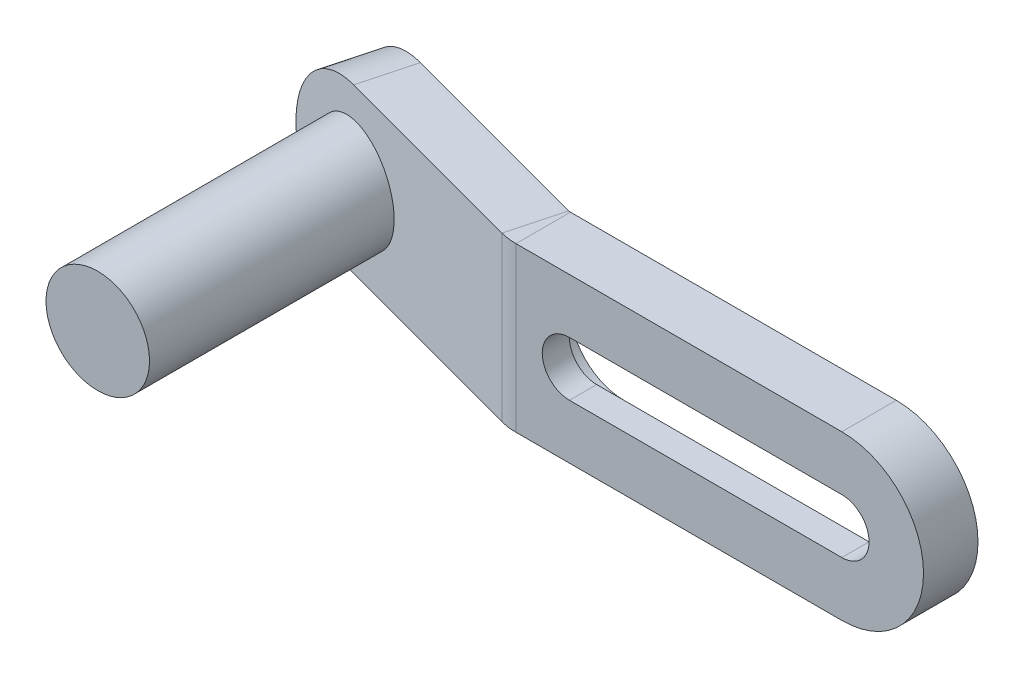
ISO-10303-21;
HEADER;
FILE_DESCRIPTION(('STEP AP214'),'2;1');
FILE_NAME('part.step','',(''),(''),'','','');
FILE_SCHEMA(('AUTOMOTIVE_DESIGN { 1 0 10303 214 1 1 1 1 }'));
ENDSEC;
DATA;
#1=APPLICATION_CONTEXT('core data for automotive mechanical design processes');
#2=APPLICATION_PROTOCOL_DEFINITION('international standard','automotive_design',2000,#1);
#3=PRODUCT_CONTEXT('',#1,'mechanical');
#4=PRODUCT('Part','Part','',(#3));
#5=PRODUCT_RELATED_PRODUCT_CATEGORY('part','',(#4));
#6=PRODUCT_DEFINITION_FORMATION('','',#4);
#7=PRODUCT_DEFINITION_CONTEXT('part definition',#1,'design');
#8=PRODUCT_DEFINITION('design','',#6,#7);
#9=PRODUCT_DEFINITION_SHAPE('','',#8);
#10=(LENGTH_UNIT() NAMED_UNIT(*) SI_UNIT(.MILLI.,.METRE.));
#11=(NAMED_UNIT(*) PLANE_ANGLE_UNIT() SI_UNIT($,.RADIAN.));
#12=(NAMED_UNIT(*) SI_UNIT($,.STERADIAN.) SOLID_ANGLE_UNIT());
#13=UNCERTAINTY_MEASURE_WITH_UNIT(LENGTH_MEASURE(1.E-05),#10,'distance_accuracy_value','');
#14=(GEOMETRIC_REPRESENTATION_CONTEXT(3) GLOBAL_UNCERTAINTY_ASSIGNED_CONTEXT((#13)) GLOBAL_UNIT_ASSIGNED_CONTEXT((#10,
#11,#12)) REPRESENTATION_CONTEXT('',''));
#15=CARTESIAN_POINT('',(0.,0.,0.));
#16=DIRECTION('',(0.,0.,1.));
#17=DIRECTION('',(1.,0.,0.));
#18=AXIS2_PLACEMENT_3D('',#15,#16,#17);
#19=CARTESIAN_POINT('',(0.,-2.49999999999999,11.3638809020505));
#20=DIRECTION('',(0.,-1.,0.));
#21=DIRECTION('',(0.,0.,-1.));
#22=AXIS2_PLACEMENT_3D('',#19,#20,#21);
#23=PLANE('',#22);
#24=DIRECTION('',(1.,0.,0.));
#25=VECTOR('',#24,1.);
#26=CARTESIAN_POINT('',(0.,-2.49999999999999,3.86388090205045));
#27=LINE('',#26,#25);
#28=CARTESIAN_POINT('',(24.6634623965384,-2.49999999999999,3.86388090205054));
#29=VERTEX_POINT('',#28);
#30=CARTESIAN_POINT('',(49.6634623965384,-2.50000000000001,3.86388090205062));
#31=VERTEX_POINT('',#30);
#32=EDGE_CURVE('E211',#29,#31,#27,.T.);
#33=ORIENTED_EDGE('',*,*,#32,.F.);
#34=DIRECTION('',(0.,0.,-1.));
#35=VECTOR('',#34,1.);
#36=CARTESIAN_POINT('',(24.6634623965383,-2.49999999999999,11.3638809020505));
#37=LINE('',#36,#35);
#38=CARTESIAN_POINT('',(24.6634623965384,-2.49999999999999,6.36388090205053));
#39=VERTEX_POINT('',#38);
#40=EDGE_CURVE('E226',#39,#29,#37,.T.);
#41=ORIENTED_EDGE('',*,*,#40,.F.);
#42=DIRECTION('',(-1.,0.,0.));
#43=VECTOR('',#42,1.);
#44=CARTESIAN_POINT('',(49.6634623965384,-2.49999999999999,6.36388090205062));
#45=LINE('',#44,#43);
#46=CARTESIAN_POINT('',(49.6634623965384,-2.5,6.36388090205061));
#47=VERTEX_POINT('',#46);
#48=EDGE_CURVE('E13',#47,#39,#45,.T.);
#49=ORIENTED_EDGE('',*,*,#48,.F.);
#50=DIRECTION('',(0.,0.,-1.));
#51=VECTOR('',#50,1.);
#52=CARTESIAN_POINT('',(49.6634623965383,-2.5,11.3638809020506));
#53=LINE('',#52,#51);
#54=EDGE_CURVE('E234',#47,#31,#53,.T.);
#55=ORIENTED_EDGE('',*,*,#54,.T.);
#56=EDGE_LOOP('',(#33,#41,#49,#55));
#57=FACE_BOUND('',#56,.T.);
#58=ADVANCED_FACE('F48',(#57),#23,.F.);
#59=CARTESIAN_POINT('',(49.6634623965383,0.,11.3638809020506));
#60=DIRECTION('',(0.,0.,-1.));
#61=DIRECTION('',(-1.,0.,0.));
#62=AXIS2_PLACEMENT_3D('',#59,#60,#61);
#63=CYLINDRICAL_SURFACE('',#62,2.5);
#64=CARTESIAN_POINT('',(49.6634623965384,0.,3.86388090205062));
#65=DIRECTION('',(0.,0.,-1.));
#66=DIRECTION('',(-1.,0.,0.));
#67=AXIS2_PLACEMENT_3D('',#64,#65,#66);
#68=CIRCLE('',#67,2.5);
#69=CARTESIAN_POINT('',(49.6634623965384,2.49999999999999,3.86388090205062));
#70=VERTEX_POINT('',#69);
#71=EDGE_CURVE('E184',#31,#70,#68,.F.);
#72=ORIENTED_EDGE('',*,*,#71,.F.);
#73=ORIENTED_EDGE('',*,*,#54,.F.);
#74=CARTESIAN_POINT('',(49.6634623965384,0.,6.36388090205062));
#75=DIRECTION('',(0.,0.,-1.));
#76=DIRECTION('',(-1.,0.,0.));
#77=AXIS2_PLACEMENT_3D('',#74,#75,#76);
#78=CIRCLE('',#77,2.5);
#79=CARTESIAN_POINT('',(49.6634623965384,2.49999999999999,6.36388090205058));
#80=VERTEX_POINT('',#79);
#81=EDGE_CURVE('E56',#80,#47,#78,.T.);
#82=ORIENTED_EDGE('',*,*,#81,.F.);
#83=DIRECTION('',(0.,0.,-1.));
#84=VECTOR('',#83,1.);
#85=CARTESIAN_POINT('',(49.6634623965383,2.49999999999999,11.3638809020506));
#86=LINE('',#85,#84);
#87=EDGE_CURVE('E238',#80,#70,#86,.T.);
#88=ORIENTED_EDGE('',*,*,#87,.T.);
#89=EDGE_LOOP('',(#72,#73,#82,#88));
#90=FACE_BOUND('',#89,.T.);
#91=ADVANCED_FACE('F334',(#90),#63,.F.);
#92=CARTESIAN_POINT('',(0.,2.49999999999999,11.3638809020505));
#93=DIRECTION('',(0.,-1.,0.));
#94=DIRECTION('',(0.,0.,-1.));
#95=AXIS2_PLACEMENT_3D('',#92,#93,#94);
#96=PLANE('',#95);
#97=DIRECTION('',(0.,0.,-1.));
#98=VECTOR('',#97,1.);
#99=CARTESIAN_POINT('',(24.6634623965383,2.49999999999999,11.3638809020505));
#100=LINE('',#99,#98);
#101=CARTESIAN_POINT('',(24.6634623965384,2.49999999999999,6.36388090205054));
#102=VERTEX_POINT('',#101);
#103=CARTESIAN_POINT('',(24.6634623965384,2.49999999999999,3.86388090205053));
#104=VERTEX_POINT('',#103);
#105=EDGE_CURVE('E241',#102,#104,#100,.T.);
#106=ORIENTED_EDGE('',*,*,#105,.T.);
#107=DIRECTION('',(-1.,0.,0.));
#108=VECTOR('',#107,1.);
#109=CARTESIAN_POINT('',(0.,2.49999999999999,3.86388090205045));
#110=LINE('',#109,#108);
#111=EDGE_CURVE('E71',#70,#104,#110,.T.);
#112=ORIENTED_EDGE('',*,*,#111,.F.);
#113=ORIENTED_EDGE('',*,*,#87,.F.);
#114=DIRECTION('',(-1.,0.,0.));
#115=VECTOR('',#114,1.);
#116=CARTESIAN_POINT('',(49.6634623965384,2.49999999999999,6.36388090205062));
#117=LINE('',#116,#115);
#118=EDGE_CURVE('E323',#80,#102,#117,.T.);
#119=ORIENTED_EDGE('',*,*,#118,.T.);
#120=EDGE_LOOP('',(#106,#112,#113,#119));
#121=FACE_BOUND('',#120,.T.);
#122=ADVANCED_FACE('F336',(#121),#96,.T.);
#123=CARTESIAN_POINT('',(24.6634623965383,0.,11.3638809020505));
#124=DIRECTION('',(0.,0.,-1.));
#125=DIRECTION('',(-1.,0.,0.));
#126=AXIS2_PLACEMENT_3D('',#123,#124,#125);
#127=CYLINDRICAL_SURFACE('',#126,2.49999999999999);
#128=CARTESIAN_POINT('',(24.6634623965384,0.,3.86388090205054));
#129=DIRECTION('',(0.,0.,-1.));
#130=DIRECTION('',(-1.,0.,0.));
#131=AXIS2_PLACEMENT_3D('',#128,#129,#130);
#132=CIRCLE('',#131,2.49999999999999);
#133=EDGE_CURVE('E209',#104,#29,#132,.F.);
#134=ORIENTED_EDGE('',*,*,#133,.F.);
#135=ORIENTED_EDGE('',*,*,#105,.F.);
#136=CARTESIAN_POINT('',(24.6634623965384,0.,6.36388090205054));
#137=DIRECTION('',(0.,0.,-1.));
#138=DIRECTION('',(-1.,0.,0.));
#139=AXIS2_PLACEMENT_3D('',#136,#137,#138);
#140=CIRCLE('',#139,2.49999999999999);
#141=EDGE_CURVE('E314',#39,#102,#140,.T.);
#142=ORIENTED_EDGE('',*,*,#141,.F.);
#143=ORIENTED_EDGE('',*,*,#40,.T.);
#144=EDGE_LOOP('',(#134,#135,#142,#143));
#145=FACE_BOUND('',#144,.T.);
#146=ADVANCED_FACE('F338',(#145),#127,.F.);
#147=CARTESIAN_POINT('',(49.6634623965384,0.,1.36388090205062));
#148=DIRECTION('',(0.,0.,-1.));
#149=DIRECTION('',(-1.,0.,0.));
#150=AXIS2_PLACEMENT_3D('',#147,#148,#149);
#151=PLANE('',#150);
#152=CARTESIAN_POINT('',(24.6634623965384,0.,1.36388090205054));
#153=DIRECTION('',(0.,0.,-1.));
#154=DIRECTION('',(-1.,0.,0.));
#155=AXIS2_PLACEMENT_3D('',#152,#153,#154);
#156=CIRCLE('',#155,4.99999999999999);
#157=CARTESIAN_POINT('',(19.7555645774293,0.955269070568109,1.36388090205052));
#158=VERTEX_POINT('',#157);
#159=CARTESIAN_POINT('',(24.6634623965384,4.99999999999999,1.36388090205054));
#160=VERTEX_POINT('',#159);
#161=EDGE_CURVE('E195',#158,#160,#156,.T.);
#162=ORIENTED_EDGE('',*,*,#161,.F.);
#163=DIRECTION('',(0.,1.,0.));
#164=VECTOR('',#163,1.);
#165=CARTESIAN_POINT('',(19.7555645774293,0.,1.36388090205052));
#166=LINE('',#165,#164);
#167=CARTESIAN_POINT('',(19.7555645774293,7.5,1.36388090205052));
#168=VERTEX_POINT('',#167);
#169=EDGE_CURVE('E303',#158,#168,#166,.T.);
#170=ORIENTED_EDGE('',*,*,#169,.T.);
#171=DIRECTION('',(1.,0.,0.));
#172=VECTOR('',#171,1.);
#173=CARTESIAN_POINT('',(49.6634623965384,7.49999999999999,1.36388090205062));
#174=LINE('',#173,#172);
#175=CARTESIAN_POINT('',(49.6634623965384,7.49999999999999,1.36388090205062));
#176=VERTEX_POINT('',#175);
#177=EDGE_CURVE('E300',#168,#176,#174,.T.);
#178=ORIENTED_EDGE('',*,*,#177,.T.);
#179=CARTESIAN_POINT('',(49.6634623965384,0.,1.36388090205062));
#180=DIRECTION('',(0.,0.,-1.));
#181=DIRECTION('',(-1.,0.,0.));
#182=AXIS2_PLACEMENT_3D('',#179,#180,#181);
#183=CIRCLE('',#182,7.5);
#184=CARTESIAN_POINT('',(49.6634623965384,-7.50000000000001,1.36388090205062));
#185=VERTEX_POINT('',#184);
#186=EDGE_CURVE('E288',#176,#185,#183,.T.);
#187=ORIENTED_EDGE('',*,*,#186,.T.);
#188=DIRECTION('',(-1.,0.,0.));
#189=VECTOR('',#188,1.);
#190=CARTESIAN_POINT('',(49.6634623965384,-7.50000000000001,1.36388090205062));
#191=LINE('',#190,#189);
#192=CARTESIAN_POINT('',(19.7555645774293,-7.5,1.36388090205052));
#193=VERTEX_POINT('',#192);
#194=EDGE_CURVE('E291',#185,#193,#191,.T.);
#195=ORIENTED_EDGE('',*,*,#194,.T.);
#196=CARTESIAN_POINT('',(19.7555645774293,-0.955269070568108,1.36388090205052));
#197=VERTEX_POINT('',#196);
#198=EDGE_CURVE('E304',#193,#197,#166,.T.);
#199=ORIENTED_EDGE('',*,*,#198,.T.);
#200=CARTESIAN_POINT('',(24.6634623965384,-4.99999999999999,1.36388090205054));
#201=VERTEX_POINT('',#200);
#202=EDGE_CURVE('E63',#201,#197,#156,.T.);
#203=ORIENTED_EDGE('',*,*,#202,.F.);
#204=DIRECTION('',(-1.,0.,0.));
#205=VECTOR('',#204,1.);
#206=CARTESIAN_POINT('',(0.,-4.99999999999999,1.36388090205045));
#207=LINE('',#206,#205);
#208=CARTESIAN_POINT('',(49.6634623965384,-5.,1.36388090205062));
#209=VERTEX_POINT('',#208);
#210=EDGE_CURVE('E217',#209,#201,#207,.T.);
#211=ORIENTED_EDGE('',*,*,#210,.F.);
#212=CARTESIAN_POINT('',(49.6634623965384,0.,1.36388090205062));
#213=DIRECTION('',(0.,0.,-1.));
#214=DIRECTION('',(-1.,0.,0.));
#215=AXIS2_PLACEMENT_3D('',#212,#213,#214);
#216=CIRCLE('',#215,5.);
#217=CARTESIAN_POINT('',(49.6634623965384,4.99999999999999,1.36388090205062));
#218=VERTEX_POINT('',#217);
#219=EDGE_CURVE('E215',#218,#209,#216,.T.);
#220=ORIENTED_EDGE('',*,*,#219,.F.);
#221=DIRECTION('',(-1.,0.,0.));
#222=VECTOR('',#221,1.);
#223=CARTESIAN_POINT('',(0.,4.99999999999999,1.36388090205045));
#224=LINE('',#223,#222);
#225=EDGE_CURVE('E178',#218,#160,#224,.T.);
#226=ORIENTED_EDGE('',*,*,#225,.T.);
#227=EDGE_LOOP('',(#162,#170,#178,#187,#195,#199,#203,#211,#220,#226));
#228=FACE_BOUND('',#227,.T.);
#229=ADVANCED_FACE('F391',(#228),#151,.T.);
#230=CARTESIAN_POINT('',(49.6634623965384,0.,1.36388090205062));
#231=DIRECTION('',(0.,0.,1.));
#232=DIRECTION('',(1.,0.,0.));
#233=AXIS2_PLACEMENT_3D('',#230,#231,#232);
#234=CYLINDRICAL_SURFACE('',#233,7.5);
#235=CARTESIAN_POINT('',(49.6634623965384,0.,6.36388090205062));
#236=DIRECTION('',(0.,0.,-1.));
#237=DIRECTION('',(-1.,0.,0.));
#238=AXIS2_PLACEMENT_3D('',#235,#236,#237);
#239=CIRCLE('',#238,7.5);
#240=CARTESIAN_POINT('',(49.6634623965384,7.49999999999999,6.36388090205062));
#241=VERTEX_POINT('',#240);
#242=CARTESIAN_POINT('',(49.6634623965384,-7.50000000000001,6.36388090205062));
#243=VERTEX_POINT('',#242);
#244=EDGE_CURVE('E260',#241,#243,#239,.T.);
#245=ORIENTED_EDGE('',*,*,#244,.T.);
#246=DIRECTION('',(0.,0.,1.));
#247=VECTOR('',#246,1.);
#248=CARTESIAN_POINT('',(49.6634623965384,-7.50000000000001,1.36388090205062));
#249=LINE('',#248,#247);
#250=EDGE_CURVE('E299',#185,#243,#249,.T.);
#251=ORIENTED_EDGE('',*,*,#250,.F.);
#252=ORIENTED_EDGE('',*,*,#186,.F.);
#253=DIRECTION('',(0.,0.,1.));
#254=VECTOR('',#253,1.);
#255=CARTESIAN_POINT('',(49.6634623965384,7.49999999999999,1.36388090205062));
#256=LINE('',#255,#254);
#257=EDGE_CURVE('E296',#176,#241,#256,.T.);
#258=ORIENTED_EDGE('',*,*,#257,.T.);
#259=EDGE_LOOP('',(#245,#251,#252,#258));
#260=FACE_BOUND('',#259,.T.);
#261=ADVANCED_FACE('F387',(#260),#234,.T.);
#262=CARTESIAN_POINT('',(49.6634623965384,-7.50000000000001,1.36388090205062));
#263=DIRECTION('',(0.,1.,0.));
#264=DIRECTION('',(-0.965925826289068,0.,0.258819045102521));
#265=AXIS2_PLACEMENT_3D('',#262,#263,#264);
#266=PLANE('',#265);
#267=DIRECTION('',(0.,0.,1.));
#268=VECTOR('',#267,1.);
#269=CARTESIAN_POINT('',(19.7555645774293,-7.5,1.36388090205052));
#270=LINE('',#269,#268);
#271=CARTESIAN_POINT('',(19.7555645774292,-7.5,6.36388090205052));
#272=VERTEX_POINT('',#271);
#273=EDGE_CURVE('E307',#193,#272,#270,.T.);
#274=ORIENTED_EDGE('',*,*,#273,.F.);
#275=ORIENTED_EDGE('',*,*,#194,.F.);
#276=ORIENTED_EDGE('',*,*,#250,.T.);
#277=DIRECTION('',(-1.,0.,0.));
#278=VECTOR('',#277,1.);
#279=CARTESIAN_POINT('',(49.6634623965384,-7.50000000000001,6.36388090205062));
#280=LINE('',#279,#278);
#281=EDGE_CURVE('E295',#243,#272,#280,.T.);
#282=ORIENTED_EDGE('',*,*,#281,.T.);
#283=EDGE_LOOP('',(#274,#275,#276,#282));
#284=FACE_BOUND('',#283,.T.);
#285=ADVANCED_FACE('F390',(#284),#266,.F.);
#286=CARTESIAN_POINT('',(49.6634623965384,7.49999999999999,1.36388090205062));
#287=DIRECTION('',(0.,-1.,0.));
#288=DIRECTION('',(0.965925826289068,0.,-0.258819045102521));
#289=AXIS2_PLACEMENT_3D('',#286,#287,#288);
#290=PLANE('',#289);
#291=DIRECTION('',(0.,0.,-1.));
#292=VECTOR('',#291,1.);
#293=CARTESIAN_POINT('',(19.7555645774293,7.5,1.36388090205052));
#294=LINE('',#293,#292);
#295=CARTESIAN_POINT('',(19.7555645774292,7.5,6.36388090205052));
#296=VERTEX_POINT('',#295);
#297=EDGE_CURVE('E311',#296,#168,#294,.T.);
#298=ORIENTED_EDGE('',*,*,#297,.F.);
#299=DIRECTION('',(1.,0.,0.));
#300=VECTOR('',#299,1.);
#301=CARTESIAN_POINT('',(49.6634623965384,7.49999999999999,6.36388090205062));
#302=LINE('',#301,#300);
#303=EDGE_CURVE('E292',#296,#241,#302,.T.);
#304=ORIENTED_EDGE('',*,*,#303,.T.);
#305=ORIENTED_EDGE('',*,*,#257,.F.);
#306=ORIENTED_EDGE('',*,*,#177,.F.);
#307=EDGE_LOOP('',(#298,#304,#305,#306));
#308=FACE_BOUND('',#307,.T.);
#309=ADVANCED_FACE('F50',(#308),#290,.F.);
#310=CARTESIAN_POINT('',(49.6634623965384,0.,6.36388090205062));
#311=DIRECTION('',(0.,0.,-1.));
#312=DIRECTION('',(-1.,0.,0.));
#313=AXIS2_PLACEMENT_3D('',#310,#311,#312);
#314=PLANE('',#313);
#315=ORIENTED_EDGE('',*,*,#81,.T.);
#316=ORIENTED_EDGE('',*,*,#48,.T.);
#317=ORIENTED_EDGE('',*,*,#141,.T.);
#318=ORIENTED_EDGE('',*,*,#118,.F.);
#319=EDGE_LOOP('',(#315,#316,#317,#318));
#320=FACE_BOUND('',#319,.T.);
#321=DIRECTION('',(0.,1.,0.));
#322=VECTOR('',#321,1.);
#323=CARTESIAN_POINT('',(19.7555645774293,0.,6.36388090205052));
#324=LINE('',#323,#322);
#325=EDGE_CURVE('E309',#272,#296,#324,.T.);
#326=ORIENTED_EDGE('',*,*,#325,.F.);
#327=ORIENTED_EDGE('',*,*,#281,.F.);
#328=ORIENTED_EDGE('',*,*,#244,.F.);
#329=ORIENTED_EDGE('',*,*,#303,.F.);
#330=EDGE_LOOP('',(#326,#327,#328,#329));
#331=FACE_BOUND('',#330,.T.);
#332=ADVANCED_FACE('F328',(#320,#331),#314,.F.);
#333=CARTESIAN_POINT('',(0.975905559500655,0.,-3.64212913144532));
#334=DIRECTION('',(-0.258819045102525,0.,0.965925826289067));
#335=DIRECTION('',(0.965925826289067,0.,0.258819045102525));
#336=AXIS2_PLACEMENT_3D('',#333,#334,#335);
#337=CYLINDRICAL_SURFACE('',#336,7.5);
#338=CARTESIAN_POINT('',(-0.318189666011968,0.,1.18750000000002));
#339=DIRECTION('',(0.258819045102525,0.,-0.965925826289067));
#340=DIRECTION('',(-0.965925826289067,0.,-0.258819045102525));
#341=AXIS2_PLACEMENT_3D('',#338,#339,#340);
#342=CIRCLE('',#341,7.5);
#343=CARTESIAN_POINT('',(-0.318189666011969,-7.5,1.18750000000002));
#344=VERTEX_POINT('',#343);
#345=CARTESIAN_POINT('',(-0.318189666011968,7.5,1.18750000000002));
#346=VERTEX_POINT('',#345);
#347=EDGE_CURVE('E285',#344,#346,#342,.T.);
#348=ORIENTED_EDGE('',*,*,#347,.T.);
#349=DIRECTION('',(-0.258819045102525,0.,0.965925826289067));
#350=VECTOR('',#349,1.);
#351=CARTESIAN_POINT('',(0.975905559500655,7.5,-3.64212913144532));
#352=LINE('',#351,#350);
#353=CARTESIAN_POINT('',(0.975905559500655,7.5,-3.64212913144532));
#354=VERTEX_POINT('',#353);
#355=EDGE_CURVE('E257',#354,#346,#352,.T.);
#356=ORIENTED_EDGE('',*,*,#355,.F.);
#357=CARTESIAN_POINT('',(0.975905559500655,0.,-3.64212913144532));
#358=DIRECTION('',(0.258819045102525,0.,-0.965925826289067));
#359=DIRECTION('',(-0.965925826289067,0.,-0.258819045102525));
#360=AXIS2_PLACEMENT_3D('',#357,#358,#359);
#361=CIRCLE('',#360,7.5);
#362=CARTESIAN_POINT('',(0.975905559500655,-7.5,-3.64212913144532));
#363=VERTEX_POINT('',#362);
#364=EDGE_CURVE('E278',#363,#354,#361,.T.);
#365=ORIENTED_EDGE('',*,*,#364,.F.);
#366=DIRECTION('',(-0.258819045102525,0.,0.965925826289067));
#367=VECTOR('',#366,1.);
#368=CARTESIAN_POINT('',(0.975905559500655,-7.5,-3.64212913144532));
#369=LINE('',#368,#367);
#370=EDGE_CURVE('E282',#363,#344,#369,.T.);
#371=ORIENTED_EDGE('',*,*,#370,.T.);
#372=EDGE_LOOP('',(#348,#356,#365,#371));
#373=FACE_BOUND('',#372,.T.);
#374=ADVANCED_FACE('F368',(#373),#337,.T.);
#375=CARTESIAN_POINT('',(49.272196873954,0.,9.29882312368091));
#376=DIRECTION('',(0.258819045102525,0.,-0.965925826289067));
#377=DIRECTION('',(-0.965925826289067,0.,-0.258819045102525));
#378=AXIS2_PLACEMENT_3D('',#375,#376,#377);
#379=PLANE('',#378);
#380=DIRECTION('',(0.,1.,0.));
#381=VECTOR('',#380,1.);
#382=CARTESIAN_POINT('',(19.5649184688068,0.,1.33878186569505));
#383=LINE('',#382,#381);
#384=CARTESIAN_POINT('',(19.5649184688068,-7.5,1.33878186569505));
#385=VERTEX_POINT('',#384);
#386=CARTESIAN_POINT('',(19.5649184688068,7.5,1.33878186569505));
#387=VERTEX_POINT('',#386);
#388=EDGE_CURVE('E253',#385,#387,#383,.T.);
#389=ORIENTED_EDGE('',*,*,#388,.F.);
#390=DIRECTION('',(-0.965925826289067,0.,-0.258819045102525));
#391=VECTOR('',#390,1.);
#392=CARTESIAN_POINT('',(49.272196873954,-7.50000000000001,9.29882312368091));
#393=LINE('',#392,#391);
#394=EDGE_CURVE('E280',#385,#363,#393,.T.);
#395=ORIENTED_EDGE('',*,*,#394,.T.);
#396=ORIENTED_EDGE('',*,*,#364,.T.);
#397=DIRECTION('',(0.965925826289067,0.,0.258819045102525));
#398=VECTOR('',#397,1.);
#399=CARTESIAN_POINT('',(49.272196873954,7.49999999999999,9.29882312368091));
#400=LINE('',#399,#398);
#401=EDGE_CURVE('E275',#354,#387,#400,.T.);
#402=ORIENTED_EDGE('',*,*,#401,.T.);
#403=EDGE_LOOP('',(#389,#395,#396,#402));
#404=FACE_BOUND('',#403,.T.);
#405=ADVANCED_FACE('F371',(#404),#379,.T.);
#406=CARTESIAN_POINT('',(49.272196873954,-7.50000000000001,9.29882312368091));
#407=DIRECTION('',(0.,1.,0.));
#408=DIRECTION('',(-1.,0.,0.));
#409=AXIS2_PLACEMENT_3D('',#406,#407,#408);
#410=PLANE('',#409);
#411=ORIENTED_EDGE('',*,*,#394,.F.);
#412=DIRECTION('',(-0.258819045102525,0.,0.965925826289067));
#413=VECTOR('',#412,1.);
#414=CARTESIAN_POINT('',(19.5649184688068,-7.5,1.33878186569505));
#415=LINE('',#414,#413);
#416=CARTESIAN_POINT('',(18.2708232432941,-7.5,6.16841099714038));
#417=VERTEX_POINT('',#416);
#418=EDGE_CURVE('E272',#385,#417,#415,.T.);
#419=ORIENTED_EDGE('',*,*,#418,.T.);
#420=DIRECTION('',(-0.965925826289067,0.,-0.258819045102525));
#421=VECTOR('',#420,1.);
#422=CARTESIAN_POINT('',(47.9781016484414,-7.50000000000001,14.1284522551262));
#423=LINE('',#422,#421);
#424=EDGE_CURVE('E270',#417,#344,#423,.T.);
#425=ORIENTED_EDGE('',*,*,#424,.T.);
#426=ORIENTED_EDGE('',*,*,#370,.F.);
#427=EDGE_LOOP('',(#411,#419,#425,#426));
#428=FACE_BOUND('',#427,.T.);
#429=ADVANCED_FACE('F375',(#428),#410,.F.);
#430=CARTESIAN_POINT('',(47.9781016484414,0.,14.1284522551262));
#431=DIRECTION('',(0.258819045102525,0.,-0.965925826289067));
#432=DIRECTION('',(-0.965925826289067,0.,-0.258819045102525));
#433=AXIS2_PLACEMENT_3D('',#430,#431,#432);
#434=PLANE('',#433);
#435=ORIENTED_EDGE('',*,*,#424,.F.);
#436=DIRECTION('',(0.,1.,0.));
#437=VECTOR('',#436,1.);
#438=CARTESIAN_POINT('',(18.2708232432941,0.,6.16841099714038));
#439=LINE('',#438,#437);
#440=CARTESIAN_POINT('',(18.2708232432941,7.5,6.16841099714038));
#441=VERTEX_POINT('',#440);
#442=EDGE_CURVE('E267',#417,#441,#439,.T.);
#443=ORIENTED_EDGE('',*,*,#442,.T.);
#444=DIRECTION('',(0.965925826289067,0.,0.258819045102525));
#445=VECTOR('',#444,1.);
#446=CARTESIAN_POINT('',(47.9781016484414,7.49999999999999,14.1284522551262));
#447=LINE('',#446,#445);
#448=EDGE_CURVE('E264',#346,#441,#447,.T.);
#449=ORIENTED_EDGE('',*,*,#448,.F.);
#450=ORIENTED_EDGE('',*,*,#347,.F.);
#451=EDGE_LOOP('',(#435,#443,#449,#450));
#452=FACE_BOUND('',#451,.T.);
#453=ADVANCED_FACE('F379',(#452),#434,.F.);
#454=CARTESIAN_POINT('',(49.272196873954,7.49999999999999,9.29882312368091));
#455=DIRECTION('',(0.,-1.,0.));
#456=DIRECTION('',(1.,0.,0.));
#457=AXIS2_PLACEMENT_3D('',#454,#455,#456);
#458=PLANE('',#457);
#459=ORIENTED_EDGE('',*,*,#448,.T.);
#460=DIRECTION('',(0.258819045102525,0.,-0.965925826289067));
#461=VECTOR('',#460,1.);
#462=CARTESIAN_POINT('',(19.5649184688068,7.5,1.33878186569505));
#463=LINE('',#462,#461);
#464=EDGE_CURVE('E261',#441,#387,#463,.T.);
#465=ORIENTED_EDGE('',*,*,#464,.T.);
#466=ORIENTED_EDGE('',*,*,#401,.F.);
#467=ORIENTED_EDGE('',*,*,#355,.T.);
#468=EDGE_LOOP('',(#459,#465,#466,#467));
#469=FACE_BOUND('',#468,.T.);
#470=ADVANCED_FACE('F363',(#469),#458,.F.);
#471=CARTESIAN_POINT('',(19.7555645774293,-7.5,0.62728090205052));
#472=DIRECTION('',(0.,1.,0.));
#473=DIRECTION('',(0.,0.,1.));
#474=AXIS2_PLACEMENT_3D('',#471,#472,#473);
#475=PLANE('',#474);
#476=ORIENTED_EDGE('',*,*,#273,.T.);
#477=CARTESIAN_POINT('',(19.7555645774293,-7.5,0.62728090205052));
#478=DIRECTION('',(0.,-1.,0.));
#479=DIRECTION('',(1.,0.,0.));
#480=AXIS2_PLACEMENT_3D('',#477,#478,#479);
#481=CIRCLE('',#480,5.7366);
#482=EDGE_CURVE('E237',#272,#417,#481,.T.);
#483=ORIENTED_EDGE('',*,*,#482,.T.);
#484=ORIENTED_EDGE('',*,*,#418,.F.);
#485=CARTESIAN_POINT('',(19.7555645774293,-7.5,0.62728090205052));
#486=DIRECTION('',(0.,-1.,0.));
#487=DIRECTION('',(0.,0.,-1.));
#488=AXIS2_PLACEMENT_3D('',#485,#486,#487);
#489=CIRCLE('',#488,0.7366);
#490=EDGE_CURVE('E246',#193,#385,#489,.T.);
#491=ORIENTED_EDGE('',*,*,#490,.F.);
#492=EDGE_LOOP('',(#476,#483,#484,#491));
#493=FACE_BOUND('',#492,.T.);
#494=ADVANCED_FACE('F360',(#493),#475,.F.);
#495=CARTESIAN_POINT('',(19.7555645774293,7.5,0.627280902050521));
#496=DIRECTION('',(0.,-1.,0.));
#497=DIRECTION('',(0.,0.,-1.));
#498=AXIS2_PLACEMENT_3D('',#495,#496,#497);
#499=PLANE('',#498);
#500=CARTESIAN_POINT('',(19.7555645774293,7.5,0.627280902050521));
#501=DIRECTION('',(0.,-1.,0.));
#502=DIRECTION('',(1.,0.,0.));
#503=AXIS2_PLACEMENT_3D('',#500,#501,#502);
#504=CIRCLE('',#503,5.7366);
#505=EDGE_CURVE('E250',#441,#296,#504,.F.);
#506=ORIENTED_EDGE('',*,*,#505,.T.);
#507=ORIENTED_EDGE('',*,*,#297,.T.);
#508=CARTESIAN_POINT('',(19.7555645774293,7.5,0.627280902050521));
#509=DIRECTION('',(0.,1.,0.));
#510=DIRECTION('',(0.,0.,1.));
#511=AXIS2_PLACEMENT_3D('',#508,#509,#510);
#512=CIRCLE('',#511,0.7366);
#513=EDGE_CURVE('E249',#387,#168,#512,.T.);
#514=ORIENTED_EDGE('',*,*,#513,.F.);
#515=ORIENTED_EDGE('',*,*,#464,.F.);
#516=EDGE_LOOP('',(#506,#507,#514,#515));
#517=FACE_BOUND('',#516,.T.);
#518=ADVANCED_FACE('F355',(#517),#499,.F.);
#519=CARTESIAN_POINT('',(19.7555645774293,15.9673004730427,0.627280902050522));
#520=DIRECTION('',(0.,-1.,0.));
#521=DIRECTION('',(1.,0.,0.));
#522=AXIS2_PLACEMENT_3D('',#519,#520,#521);
#523=CYLINDRICAL_SURFACE('',#522,0.7366);
#524=ORIENTED_EDGE('',*,*,#388,.T.);
#525=ORIENTED_EDGE('',*,*,#513,.T.);
#526=ORIENTED_EDGE('',*,*,#169,.F.);
#527=DIRECTION('',(0.,1.,0.));
#528=VECTOR('',#527,1.);
#529=CARTESIAN_POINT('',(19.7555645774293,0.,1.36388090205052));
#530=LINE('',#529,#528);
#531=EDGE_CURVE('E221',#197,#158,#530,.T.);
#532=ORIENTED_EDGE('',*,*,#531,.F.);
#533=ORIENTED_EDGE('',*,*,#198,.F.);
#534=ORIENTED_EDGE('',*,*,#490,.T.);
#535=EDGE_LOOP('',(#524,#525,#526,#532,#533,#534));
#536=FACE_BOUND('',#535,.T.);
#537=ADVANCED_FACE('F351',(#536),#523,.F.);
#538=CARTESIAN_POINT('',(19.7555645774293,15.9673004730427,0.627280902050522));
#539=DIRECTION('',(0.,-1.,0.));
#540=DIRECTION('',(1.,0.,0.));
#541=AXIS2_PLACEMENT_3D('',#538,#539,#540);
#542=CYLINDRICAL_SURFACE('',#541,5.7366);
#543=ORIENTED_EDGE('',*,*,#442,.F.);
#544=ORIENTED_EDGE('',*,*,#482,.F.);
#545=ORIENTED_EDGE('',*,*,#325,.T.);
#546=ORIENTED_EDGE('',*,*,#505,.F.);
#547=EDGE_LOOP('',(#543,#544,#545,#546));
#548=FACE_BOUND('',#547,.T.);
#549=ADVANCED_FACE('F354',(#548),#542,.T.);
#550=CARTESIAN_POINT('',(0.,4.99999999999999,3.86388090205045));
#551=DIRECTION('',(0.,-1.,0.));
#552=DIRECTION('',(0.,0.,-1.));
#553=AXIS2_PLACEMENT_3D('',#550,#551,#552);
#554=PLANE('',#553);
#555=ORIENTED_EDGE('',*,*,#225,.F.);
#556=DIRECTION('',(0.,0.,-1.));
#557=VECTOR('',#556,1.);
#558=CARTESIAN_POINT('',(49.6634623965384,4.99999999999999,3.86388090205062));
#559=LINE('',#558,#557);
#560=CARTESIAN_POINT('',(49.6634623965384,4.99999999999999,3.86388090205062));
#561=VERTEX_POINT('',#560);
#562=EDGE_CURVE('E172',#561,#218,#559,.T.);
#563=ORIENTED_EDGE('',*,*,#562,.F.);
#564=DIRECTION('',(-1.,0.,0.));
#565=VECTOR('',#564,1.);
#566=CARTESIAN_POINT('',(0.,4.99999999999999,3.86388090205045));
#567=LINE('',#566,#565);
#568=CARTESIAN_POINT('',(24.6634623965384,4.99999999999999,3.86388090205054));
#569=VERTEX_POINT('',#568);
#570=EDGE_CURVE('E175',#561,#569,#567,.T.);
#571=ORIENTED_EDGE('',*,*,#570,.T.);
#572=DIRECTION('',(0.,0.,-1.));
#573=VECTOR('',#572,1.);
#574=CARTESIAN_POINT('',(24.6634623965384,4.99999999999999,3.86388090205054));
#575=LINE('',#574,#573);
#576=EDGE_CURVE('E224',#569,#160,#575,.T.);
#577=ORIENTED_EDGE('',*,*,#576,.T.);
#578=EDGE_LOOP('',(#555,#563,#571,#577));
#579=FACE_BOUND('',#578,.T.);
#580=ADVANCED_FACE('F174',(#579),#554,.T.);
#581=CARTESIAN_POINT('',(24.6634623965384,0.,3.86388090205054));
#582=DIRECTION('',(0.,0.,-1.));
#583=DIRECTION('',(-1.,0.,0.));
#584=AXIS2_PLACEMENT_3D('',#581,#582,#583);
#585=CYLINDRICAL_SURFACE('',#584,4.99999999999999);
#586=ORIENTED_EDGE('',*,*,#161,.T.);
#587=ORIENTED_EDGE('',*,*,#576,.F.);
#588=CARTESIAN_POINT('',(24.6634623965384,0.,3.86388090205054));
#589=DIRECTION('',(0.,0.,-1.));
#590=DIRECTION('',(-1.,0.,0.));
#591=AXIS2_PLACEMENT_3D('',#588,#589,#590);
#592=CIRCLE('',#591,4.99999999999999);
#593=CARTESIAN_POINT('',(19.7555645774293,0.955269070568109,3.86388090205052));
#594=VERTEX_POINT('',#593);
#595=EDGE_CURVE('E194',#594,#569,#592,.T.);
#596=ORIENTED_EDGE('',*,*,#595,.F.);
#597=DIRECTION('',(0.,0.,-1.));
#598=VECTOR('',#597,1.);
#599=CARTESIAN_POINT('',(19.7555645774293,0.955269070568109,3.86388090205052));
#600=LINE('',#599,#598);
#601=EDGE_CURVE('E227',#594,#158,#600,.T.);
#602=ORIENTED_EDGE('',*,*,#601,.T.);
#603=EDGE_LOOP('',(#586,#587,#596,#602));
#604=FACE_BOUND('',#603,.T.);
#605=ADVANCED_FACE('F441',(#604),#585,.F.);
#606=CARTESIAN_POINT('',(19.7555645774293,0.,3.86388090205052));
#607=DIRECTION('',(-1.,0.,0.));
#608=DIRECTION('',(0.,0.,1.));
#609=AXIS2_PLACEMENT_3D('',#606,#607,#608);
#610=PLANE('',#609);
#611=ORIENTED_EDGE('',*,*,#531,.T.);
#612=ORIENTED_EDGE('',*,*,#601,.F.);
#613=DIRECTION('',(0.,1.,0.));
#614=VECTOR('',#613,1.);
#615=CARTESIAN_POINT('',(19.7555645774293,0.,3.86388090205052));
#616=LINE('',#615,#614);
#617=CARTESIAN_POINT('',(19.7555645774293,-0.955269070568108,3.86388090205052));
#618=VERTEX_POINT('',#617);
#619=EDGE_CURVE('E206',#618,#594,#616,.T.);
#620=ORIENTED_EDGE('',*,*,#619,.F.);
#621=DIRECTION('',(0.,0.,-1.));
#622=VECTOR('',#621,1.);
#623=CARTESIAN_POINT('',(19.7555645774293,-0.955269070568108,3.86388090205052));
#624=LINE('',#623,#622);
#625=EDGE_CURVE('E229',#618,#197,#624,.T.);
#626=ORIENTED_EDGE('',*,*,#625,.T.);
#627=EDGE_LOOP('',(#611,#612,#620,#626));
#628=FACE_BOUND('',#627,.T.);
#629=ADVANCED_FACE('F439',(#628),#610,.F.);
#630=ORIENTED_EDGE('',*,*,#202,.T.);
#631=ORIENTED_EDGE('',*,*,#625,.F.);
#632=CARTESIAN_POINT('',(24.6634623965384,-4.99999999999999,3.86388090205054));
#633=VERTEX_POINT('',#632);
#634=EDGE_CURVE('E201',#633,#618,#592,.T.);
#635=ORIENTED_EDGE('',*,*,#634,.F.);
#636=DIRECTION('',(0.,0.,-1.));
#637=VECTOR('',#636,1.);
#638=CARTESIAN_POINT('',(24.6634623965384,-4.99999999999999,3.86388090205054));
#639=LINE('',#638,#637);
#640=EDGE_CURVE('E231',#633,#201,#639,.T.);
#641=ORIENTED_EDGE('',*,*,#640,.T.);
#642=EDGE_LOOP('',(#630,#631,#635,#641));
#643=FACE_BOUND('',#642,.T.);
#644=ADVANCED_FACE('F437',(#643),#585,.F.);
#645=CARTESIAN_POINT('',(0.,-4.99999999999999,3.86388090205045));
#646=DIRECTION('',(0.,-1.,0.));
#647=DIRECTION('',(0.,0.,-1.));
#648=AXIS2_PLACEMENT_3D('',#645,#646,#647);
#649=PLANE('',#648);
#650=ORIENTED_EDGE('',*,*,#210,.T.);
#651=ORIENTED_EDGE('',*,*,#640,.F.);
#652=DIRECTION('',(-1.,0.,0.));
#653=VECTOR('',#652,1.);
#654=CARTESIAN_POINT('',(0.,-4.99999999999999,3.86388090205045));
#655=LINE('',#654,#653);
#656=CARTESIAN_POINT('',(49.6634623965384,-5.,3.86388090205062));
#657=VERTEX_POINT('',#656);
#658=EDGE_CURVE('E199',#657,#633,#655,.T.);
#659=ORIENTED_EDGE('',*,*,#658,.F.);
#660=DIRECTION('',(0.,0.,-1.));
#661=VECTOR('',#660,1.);
#662=CARTESIAN_POINT('',(49.6634623965384,-5.,3.86388090205062));
#663=LINE('',#662,#661);
#664=EDGE_CURVE('E183',#657,#209,#663,.T.);
#665=ORIENTED_EDGE('',*,*,#664,.T.);
#666=EDGE_LOOP('',(#650,#651,#659,#665));
#667=FACE_BOUND('',#666,.T.);
#668=ADVANCED_FACE('F434',(#667),#649,.F.);
#669=CARTESIAN_POINT('',(49.6634623965384,0.,3.86388090205062));
#670=DIRECTION('',(0.,0.,-1.));
#671=DIRECTION('',(-1.,0.,0.));
#672=AXIS2_PLACEMENT_3D('',#669,#670,#671);
#673=CYLINDRICAL_SURFACE('',#672,5.);
#674=ORIENTED_EDGE('',*,*,#219,.T.);
#675=ORIENTED_EDGE('',*,*,#664,.F.);
#676=CARTESIAN_POINT('',(49.6634623965384,0.,3.86388090205062));
#677=DIRECTION('',(0.,0.,-1.));
#678=DIRECTION('',(-1.,0.,0.));
#679=AXIS2_PLACEMENT_3D('',#676,#677,#678);
#680=CIRCLE('',#679,5.);
#681=EDGE_CURVE('E191',#561,#657,#680,.T.);
#682=ORIENTED_EDGE('',*,*,#681,.F.);
#683=ORIENTED_EDGE('',*,*,#562,.T.);
#684=EDGE_LOOP('',(#674,#675,#682,#683));
#685=FACE_BOUND('',#684,.T.);
#686=ADVANCED_FACE('F197',(#685),#673,.F.);
#687=CARTESIAN_POINT('',(0.,0.,3.86388090205045));
#688=DIRECTION('',(0.,0.,-1.));
#689=DIRECTION('',(-1.,0.,0.));
#690=AXIS2_PLACEMENT_3D('',#687,#688,#689);
#691=PLANE('',#690);
#692=ORIENTED_EDGE('',*,*,#570,.F.);
#693=ORIENTED_EDGE('',*,*,#681,.T.);
#694=ORIENTED_EDGE('',*,*,#658,.T.);
#695=ORIENTED_EDGE('',*,*,#634,.T.);
#696=ORIENTED_EDGE('',*,*,#619,.T.);
#697=ORIENTED_EDGE('',*,*,#595,.T.);
#698=EDGE_LOOP('',(#692,#693,#694,#695,#696,#697));
#699=FACE_BOUND('',#698,.T.);
#700=ORIENTED_EDGE('',*,*,#111,.T.);
#701=ORIENTED_EDGE('',*,*,#133,.T.);
#702=ORIENTED_EDGE('',*,*,#32,.T.);
#703=ORIENTED_EDGE('',*,*,#71,.T.);
#704=EDGE_LOOP('',(#700,#701,#702,#703));
#705=FACE_BOUND('',#704,.T.);
#706=ADVANCED_FACE('F189',(#699,#705),#691,.T.);
#707=CLOSED_SHELL('',(#58,#91,#122,#146,#229,#261,#285,#309,#332,#374,#405,#429,#453,#470,#494,
#518,#537,#549,#580,#605,#629,#644,#668,#686,#706));
#708=MANIFOLD_SOLID_BREP('B2',#707);
#709=CARTESIAN_POINT('',(0.,0.,25.));
#710=DIRECTION('',(0.,0.,-1.));
#711=DIRECTION('',(-1.,0.,0.));
#712=AXIS2_PLACEMENT_3D('',#709,#710,#711);
#713=CYLINDRICAL_SURFACE('',#712,4.75);
#714=CARTESIAN_POINT('',(0.,0.,25.));
#715=DIRECTION('',(0.,0.,1.));
#716=DIRECTION('',(1.,0.,0.));
#717=AXIS2_PLACEMENT_3D('',#714,#715,#716);
#718=CIRCLE('',#717,4.75);
#719=CARTESIAN_POINT('',(4.75,0.,25.));
#720=VERTEX_POINT('',#719);
#721=EDGE_CURVE('E47',#720,#720,#718,.T.);
#722=ORIENTED_EDGE('',*,*,#721,.F.);
#723=EDGE_LOOP('',(#722));
#724=FACE_BOUND('',#723,.T.);
#725=CARTESIAN_POINT('',(0.,0.,1.27275866404785));
#726=DIRECTION('',(-0.258819045102525,0.,0.965925826289067));
#727=DIRECTION('',(-0.965925826289067,0.,-0.258819045102525));
#728=AXIS2_PLACEMENT_3D('',#725,#726,#727);
#729=ELLIPSE('',#728,4.9175618569479,4.75);
#730=CARTESIAN_POINT('',(-4.75,0.,0.));
#731=VERTEX_POINT('',#730);
#732=EDGE_CURVE('E652',#731,#731,#729,.T.);
#733=ORIENTED_EDGE('',*,*,#732,.T.);
#734=EDGE_LOOP('',(#733));
#735=FACE_BOUND('',#734,.T.);
#736=ADVANCED_FACE('F641',(#724,#735),#713,.T.);
#737=CARTESIAN_POINT('',(0.,0.,25.));
#738=DIRECTION('',(0.,0.,1.));
#739=DIRECTION('',(1.,0.,0.));
#740=AXIS2_PLACEMENT_3D('',#737,#738,#739);
#741=PLANE('',#740);
#742=ORIENTED_EDGE('',*,*,#721,.T.);
#743=EDGE_LOOP('',(#742));
#744=FACE_BOUND('',#743,.T.);
#745=ADVANCED_FACE('F668',(#744),#741,.T.);
#746=CARTESIAN_POINT('',(-4.75,-4.75,0.));
#747=DIRECTION('',(-0.258819045102525,0.,0.965925826289067));
#748=DIRECTION('',(0.965925826289067,0.,0.258819045102525));
#749=AXIS2_PLACEMENT_3D('',#746,#747,#748);
#750=PLANE('',#749);
#751=CARTESIAN_POINT('',(0.,0.,1.27275866404785));
#752=DIRECTION('',(-0.258819045102525,0.,0.965925826289067));
#753=DIRECTION('',(-0.965925826289067,0.,-0.258819045102525));
#754=AXIS2_PLACEMENT_3D('',#751,#752,#753);
#755=ELLIPSE('',#754,2.58819045102521,2.5);
#756=CARTESIAN_POINT('',(-2.5,0.,0.602885682970036));
#757=VERTEX_POINT('',#756);
#758=EDGE_CURVE('E644',#757,#757,#755,.F.);
#759=ORIENTED_EDGE('',*,*,#758,.F.);
#760=EDGE_LOOP('',(#759));
#761=FACE_BOUND('',#760,.T.);
#762=ORIENTED_EDGE('',*,*,#732,.F.);
#763=EDGE_LOOP('',(#762));
#764=FACE_BOUND('',#763,.T.);
#765=ADVANCED_FACE('F664',(#761,#764),#750,.F.);
#766=CARTESIAN_POINT('',(0.,0.,3.));
#767=DIRECTION('',(0.,0.,-1.));
#768=DIRECTION('',(-1.,0.,0.));
#769=AXIS2_PLACEMENT_3D('',#766,#767,#768);
#770=PLANE('',#769);
#771=CARTESIAN_POINT('',(0.,0.,3.));
#772=DIRECTION('',(0.,0.,-1.));
#773=DIRECTION('',(-1.,0.,0.));
#774=AXIS2_PLACEMENT_3D('',#771,#772,#773);
#775=CIRCLE('',#774,2.5);
#776=CARTESIAN_POINT('',(-2.5,0.,3.));
#777=VERTEX_POINT('',#776);
#778=EDGE_CURVE('E648',#777,#777,#775,.T.);
#779=ORIENTED_EDGE('',*,*,#778,.T.);
#780=EDGE_LOOP('',(#779));
#781=FACE_BOUND('',#780,.T.);
#782=ADVANCED_FACE('F667',(#781),#770,.T.);
#783=CARTESIAN_POINT('',(0.,0.,3.));
#784=DIRECTION('',(0.,0.,-1.));
#785=DIRECTION('',(-1.,0.,0.));
#786=AXIS2_PLACEMENT_3D('',#783,#784,#785);
#787=CYLINDRICAL_SURFACE('',#786,2.5);
#788=ORIENTED_EDGE('',*,*,#758,.T.);
#789=EDGE_LOOP('',(#788));
#790=FACE_BOUND('',#789,.T.);
#791=ORIENTED_EDGE('',*,*,#778,.F.);
#792=EDGE_LOOP('',(#791));
#793=FACE_BOUND('',#792,.T.);
#794=ADVANCED_FACE('F661',(#790,#793),#787,.F.);
#795=CLOSED_SHELL('',(#736,#745,#765,#782,#794));
#796=MANIFOLD_SOLID_BREP('B7',#795);
#797=ADVANCED_BREP_SHAPE_REPRESENTATION('',(#18,#708,#796),#14);
#798=SHAPE_DEFINITION_REPRESENTATION(#9,#797);
ENDSEC;
END-ISO-10303-21;
